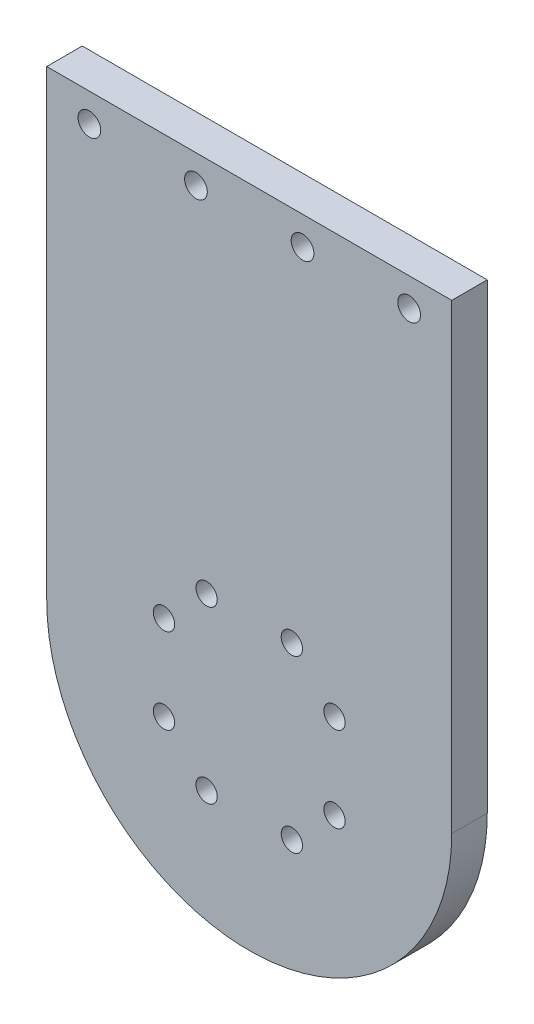
ISO-10303-21;
HEADER;
FILE_DESCRIPTION(('STEP AP214'),'2;1');
FILE_NAME('part.step','',(''),(''),'','','');
FILE_SCHEMA(('AUTOMOTIVE_DESIGN { 1 0 10303 214 1 1 1 1 }'));
ENDSEC;
DATA;
#1=APPLICATION_CONTEXT('core data for automotive mechanical design processes');
#2=APPLICATION_PROTOCOL_DEFINITION('international standard','automotive_design',2000,#1);
#3=PRODUCT_CONTEXT('',#1,'mechanical');
#4=PRODUCT('Part','Part','',(#3));
#5=PRODUCT_RELATED_PRODUCT_CATEGORY('part','',(#4));
#6=PRODUCT_DEFINITION_FORMATION('','',#4);
#7=PRODUCT_DEFINITION_CONTEXT('part definition',#1,'design');
#8=PRODUCT_DEFINITION('design','',#6,#7);
#9=PRODUCT_DEFINITION_SHAPE('','',#8);
#10=(LENGTH_UNIT() NAMED_UNIT(*) SI_UNIT(.MILLI.,.METRE.));
#11=(NAMED_UNIT(*) PLANE_ANGLE_UNIT() SI_UNIT($,.RADIAN.));
#12=(NAMED_UNIT(*) SI_UNIT($,.STERADIAN.) SOLID_ANGLE_UNIT());
#13=UNCERTAINTY_MEASURE_WITH_UNIT(LENGTH_MEASURE(1.E-05),#10,'distance_accuracy_value','');
#14=(GEOMETRIC_REPRESENTATION_CONTEXT(3) GLOBAL_UNCERTAINTY_ASSIGNED_CONTEXT((#13)) GLOBAL_UNIT_ASSIGNED_CONTEXT((#10,
#11,#12)) REPRESENTATION_CONTEXT('',''));
#15=CARTESIAN_POINT('',(0.,0.,0.));
#16=DIRECTION('',(0.,0.,1.));
#17=DIRECTION('',(1.,0.,0.));
#18=AXIS2_PLACEMENT_3D('',#15,#16,#17);
#19=CARTESIAN_POINT('',(22.5,-4.,-0.00100000000000013));
#20=DIRECTION('',(0.,0.,1.));
#21=DIRECTION('',(1.,0.,0.));
#22=AXIS2_PLACEMENT_3D('',#19,#20,#21);
#23=CYLINDRICAL_SURFACE('',#22,1.6);
#24=CARTESIAN_POINT('',(22.5,-4.,5.));
#25=DIRECTION('',(0.,0.,1.));
#26=DIRECTION('',(1.,0.,0.));
#27=AXIS2_PLACEMENT_3D('',#24,#25,#26);
#28=CIRCLE('',#27,1.6);
#29=CARTESIAN_POINT('',(24.1,-4.,5.));
#30=VERTEX_POINT('',#29);
#31=EDGE_CURVE('E50',#30,#30,#28,.T.);
#32=ORIENTED_EDGE('',*,*,#31,.T.);
#33=EDGE_LOOP('',(#32));
#34=FACE_BOUND('',#33,.T.);
#35=CARTESIAN_POINT('',(22.5,-4.,0.));
#36=DIRECTION('',(0.,0.,1.));
#37=DIRECTION('',(1.,0.,0.));
#38=AXIS2_PLACEMENT_3D('',#35,#36,#37);
#39=CIRCLE('',#38,1.6);
#40=CARTESIAN_POINT('',(24.1,-4.,0.));
#41=VERTEX_POINT('',#40);
#42=EDGE_CURVE('E11',#41,#41,#39,.F.);
#43=ORIENTED_EDGE('',*,*,#42,.T.);
#44=EDGE_LOOP('',(#43));
#45=FACE_BOUND('',#44,.T.);
#46=ADVANCED_FACE('F41',(#34,#45),#23,.F.);
#47=CARTESIAN_POINT('',(7.5,-4.,-0.00100000000000013));
#48=DIRECTION('',(0.,0.,1.));
#49=DIRECTION('',(1.,0.,0.));
#50=AXIS2_PLACEMENT_3D('',#47,#48,#49);
#51=CYLINDRICAL_SURFACE('',#50,1.6);
#52=CARTESIAN_POINT('',(7.5,-4.,5.));
#53=DIRECTION('',(0.,0.,1.));
#54=DIRECTION('',(1.,0.,0.));
#55=AXIS2_PLACEMENT_3D('',#52,#53,#54);
#56=CIRCLE('',#55,1.6);
#57=CARTESIAN_POINT('',(9.1,-4.,5.));
#58=VERTEX_POINT('',#57);
#59=EDGE_CURVE('E133',#58,#58,#56,.T.);
#60=ORIENTED_EDGE('',*,*,#59,.T.);
#61=EDGE_LOOP('',(#60));
#62=FACE_BOUND('',#61,.T.);
#63=CARTESIAN_POINT('',(7.5,-4.,0.));
#64=DIRECTION('',(0.,0.,1.));
#65=DIRECTION('',(1.,0.,0.));
#66=AXIS2_PLACEMENT_3D('',#63,#64,#65);
#67=CIRCLE('',#66,1.6);
#68=CARTESIAN_POINT('',(9.1,-4.,0.));
#69=VERTEX_POINT('',#68);
#70=EDGE_CURVE('E137',#69,#69,#67,.F.);
#71=ORIENTED_EDGE('',*,*,#70,.T.);
#72=EDGE_LOOP('',(#71));
#73=FACE_BOUND('',#72,.T.);
#74=ADVANCED_FACE('F163',(#62,#73),#51,.F.);
#75=CARTESIAN_POINT('',(-28.5,0.,5.));
#76=DIRECTION('',(1.,0.,0.));
#77=DIRECTION('',(0.,1.,0.));
#78=AXIS2_PLACEMENT_3D('',#75,#76,#77);
#79=PLANE('',#78);
#80=DIRECTION('',(0.,-1.,0.));
#81=VECTOR('',#80,1.);
#82=CARTESIAN_POINT('',(-28.5,0.,0.));
#83=LINE('',#82,#81);
#84=CARTESIAN_POINT('',(-28.5,0.,0.));
#85=VERTEX_POINT('',#84);
#86=CARTESIAN_POINT('',(-28.5,-65.,0.));
#87=VERTEX_POINT('',#86);
#88=EDGE_CURVE('E114',#85,#87,#83,.T.);
#89=ORIENTED_EDGE('',*,*,#88,.T.);
#90=DIRECTION('',(0.,0.,-1.));
#91=VECTOR('',#90,1.);
#92=CARTESIAN_POINT('',(-28.5,-65.,5.));
#93=LINE('',#92,#91);
#94=CARTESIAN_POINT('',(-28.5,-65.,5.));
#95=VERTEX_POINT('',#94);
#96=EDGE_CURVE('E104',#95,#87,#93,.T.);
#97=ORIENTED_EDGE('',*,*,#96,.F.);
#98=DIRECTION('',(0.,-1.,0.));
#99=VECTOR('',#98,1.);
#100=CARTESIAN_POINT('',(-28.5,0.,5.));
#101=LINE('',#100,#99);
#102=CARTESIAN_POINT('',(-28.5,0.,5.));
#103=VERTEX_POINT('',#102);
#104=EDGE_CURVE('E93',#103,#95,#101,.T.);
#105=ORIENTED_EDGE('',*,*,#104,.F.);
#106=DIRECTION('',(0.,0.,-1.));
#107=VECTOR('',#106,1.);
#108=CARTESIAN_POINT('',(-28.5,0.,5.));
#109=LINE('',#108,#107);
#110=EDGE_CURVE('E58',#103,#85,#109,.T.);
#111=ORIENTED_EDGE('',*,*,#110,.T.);
#112=EDGE_LOOP('',(#89,#97,#105,#111));
#113=FACE_BOUND('',#112,.T.);
#114=ADVANCED_FACE('F167',(#113),#79,.F.);
#115=CARTESIAN_POINT('',(0.,-65.,5.));
#116=DIRECTION('',(0.,0.,-1.));
#117=DIRECTION('',(-1.,0.,0.));
#118=AXIS2_PLACEMENT_3D('',#115,#116,#117);
#119=CYLINDRICAL_SURFACE('',#118,28.5);
#120=CARTESIAN_POINT('',(0.,-65.,0.));
#121=DIRECTION('',(0.,0.,1.));
#122=DIRECTION('',(1.,0.,0.));
#123=AXIS2_PLACEMENT_3D('',#120,#121,#122);
#124=CIRCLE('',#123,28.5);
#125=CARTESIAN_POINT('',(28.5,-65.,0.));
#126=VERTEX_POINT('',#125);
#127=EDGE_CURVE('E100',#87,#126,#124,.T.);
#128=ORIENTED_EDGE('',*,*,#127,.T.);
#129=DIRECTION('',(0.,0.,-1.));
#130=VECTOR('',#129,1.);
#131=CARTESIAN_POINT('',(28.5,-65.,5.));
#132=LINE('',#131,#130);
#133=CARTESIAN_POINT('',(28.5,-65.,5.));
#134=VERTEX_POINT('',#133);
#135=EDGE_CURVE('E98',#134,#126,#132,.T.);
#136=ORIENTED_EDGE('',*,*,#135,.F.);
#137=CARTESIAN_POINT('',(0.,-65.,5.));
#138=DIRECTION('',(0.,0.,1.));
#139=DIRECTION('',(1.,0.,0.));
#140=AXIS2_PLACEMENT_3D('',#137,#138,#139);
#141=CIRCLE('',#140,28.5);
#142=EDGE_CURVE('E84',#95,#134,#141,.T.);
#143=ORIENTED_EDGE('',*,*,#142,.F.);
#144=ORIENTED_EDGE('',*,*,#96,.T.);
#145=EDGE_LOOP('',(#128,#136,#143,#144));
#146=FACE_BOUND('',#145,.T.);
#147=ADVANCED_FACE('F99',(#146),#119,.T.);
#148=CARTESIAN_POINT('',(28.5,0.,5.));
#149=DIRECTION('',(1.,0.,0.));
#150=DIRECTION('',(0.,1.,0.));
#151=AXIS2_PLACEMENT_3D('',#148,#149,#150);
#152=PLANE('',#151);
#153=DIRECTION('',(0.,-1.,0.));
#154=VECTOR('',#153,1.);
#155=CARTESIAN_POINT('',(28.5,0.,0.));
#156=LINE('',#155,#154);
#157=CARTESIAN_POINT('',(28.5,0.,0.));
#158=VERTEX_POINT('',#157);
#159=EDGE_CURVE('E120',#158,#126,#156,.T.);
#160=ORIENTED_EDGE('',*,*,#159,.F.);
#161=DIRECTION('',(0.,0.,-1.));
#162=VECTOR('',#161,1.);
#163=CARTESIAN_POINT('',(28.5,0.,5.));
#164=LINE('',#163,#162);
#165=CARTESIAN_POINT('',(28.5,0.,5.));
#166=VERTEX_POINT('',#165);
#167=EDGE_CURVE('E72',#166,#158,#164,.T.);
#168=ORIENTED_EDGE('',*,*,#167,.F.);
#169=DIRECTION('',(0.,-1.,0.));
#170=VECTOR('',#169,1.);
#171=CARTESIAN_POINT('',(28.5,0.,5.));
#172=LINE('',#171,#170);
#173=EDGE_CURVE('E92',#166,#134,#172,.T.);
#174=ORIENTED_EDGE('',*,*,#173,.T.);
#175=ORIENTED_EDGE('',*,*,#135,.T.);
#176=EDGE_LOOP('',(#160,#168,#174,#175));
#177=FACE_BOUND('',#176,.T.);
#178=ADVANCED_FACE('F106',(#177),#152,.T.);
#179=CARTESIAN_POINT('',(-28.5,0.,5.));
#180=DIRECTION('',(0.,1.,0.));
#181=DIRECTION('',(0.,0.,1.));
#182=AXIS2_PLACEMENT_3D('',#179,#180,#181);
#183=PLANE('',#182);
#184=DIRECTION('',(1.,0.,0.));
#185=VECTOR('',#184,1.);
#186=CARTESIAN_POINT('',(-28.5,0.,0.));
#187=LINE('',#186,#185);
#188=EDGE_CURVE('E123',#85,#158,#187,.T.);
#189=ORIENTED_EDGE('',*,*,#188,.F.);
#190=ORIENTED_EDGE('',*,*,#110,.F.);
#191=DIRECTION('',(1.,0.,0.));
#192=VECTOR('',#191,1.);
#193=CARTESIAN_POINT('',(-28.5,0.,5.));
#194=LINE('',#193,#192);
#195=EDGE_CURVE('E108',#103,#166,#194,.T.);
#196=ORIENTED_EDGE('',*,*,#195,.T.);
#197=ORIENTED_EDGE('',*,*,#167,.T.);
#198=EDGE_LOOP('',(#189,#190,#196,#197));
#199=FACE_BOUND('',#198,.T.);
#200=ADVANCED_FACE('F148',(#199),#183,.T.);
#201=CARTESIAN_POINT('',(0.,-65.,5.));
#202=DIRECTION('',(0.,0.,1.));
#203=DIRECTION('',(1.,0.,0.));
#204=AXIS2_PLACEMENT_3D('',#201,#202,#203);
#205=PLANE('',#204);
#206=CARTESIAN_POINT('',(-12.,-71.,5.));
#207=DIRECTION('',(0.,0.,1.));
#208=DIRECTION('',(0.,1.,0.));
#209=AXIS2_PLACEMENT_3D('',#206,#207,#208);
#210=CIRCLE('',#209,1.5);
#211=CARTESIAN_POINT('',(-12.,-69.5,5.));
#212=VERTEX_POINT('',#211);
#213=EDGE_CURVE('E308',#212,#212,#210,.T.);
#214=ORIENTED_EDGE('',*,*,#213,.F.);
#215=EDGE_LOOP('',(#214));
#216=FACE_BOUND('',#215,.T.);
#217=CARTESIAN_POINT('',(-5.99999999999996,-77.,5.));
#218=DIRECTION('',(0.,0.,1.));
#219=DIRECTION('',(0.,1.,0.));
#220=AXIS2_PLACEMENT_3D('',#217,#218,#219);
#221=CIRCLE('',#220,1.5);
#222=CARTESIAN_POINT('',(-5.99999999999996,-75.5,5.));
#223=VERTEX_POINT('',#222);
#224=EDGE_CURVE('E323',#223,#223,#221,.T.);
#225=ORIENTED_EDGE('',*,*,#224,.F.);
#226=EDGE_LOOP('',(#225));
#227=FACE_BOUND('',#226,.T.);
#228=CARTESIAN_POINT('',(6.,-77.,5.));
#229=DIRECTION('',(0.,0.,1.));
#230=DIRECTION('',(-1.,0.,0.));
#231=AXIS2_PLACEMENT_3D('',#228,#229,#230);
#232=CIRCLE('',#231,1.5);
#233=CARTESIAN_POINT('',(4.5,-77.,5.));
#234=VERTEX_POINT('',#233);
#235=EDGE_CURVE('E331',#234,#234,#232,.T.);
#236=ORIENTED_EDGE('',*,*,#235,.F.);
#237=EDGE_LOOP('',(#236));
#238=FACE_BOUND('',#237,.T.);
#239=CARTESIAN_POINT('',(12.,-71.,5.));
#240=DIRECTION('',(0.,0.,1.));
#241=DIRECTION('',(-1.,0.,0.));
#242=AXIS2_PLACEMENT_3D('',#239,#240,#241);
#243=CIRCLE('',#242,1.5);
#244=CARTESIAN_POINT('',(10.5,-71.,5.));
#245=VERTEX_POINT('',#244);
#246=EDGE_CURVE('E339',#245,#245,#243,.T.);
#247=ORIENTED_EDGE('',*,*,#246,.F.);
#248=EDGE_LOOP('',(#247));
#249=FACE_BOUND('',#248,.T.);
#250=CARTESIAN_POINT('',(11.9999999999999,-58.9999999999999,5.));
#251=DIRECTION('',(0.,0.,1.));
#252=DIRECTION('',(0.,-1.,0.));
#253=AXIS2_PLACEMENT_3D('',#250,#251,#252);
#254=CIRCLE('',#253,1.5);
#255=CARTESIAN_POINT('',(12.,-60.4999999999999,5.));
#256=VERTEX_POINT('',#255);
#257=EDGE_CURVE('E347',#256,#256,#254,.T.);
#258=ORIENTED_EDGE('',*,*,#257,.F.);
#259=EDGE_LOOP('',(#258));
#260=FACE_BOUND('',#259,.T.);
#261=CARTESIAN_POINT('',(5.99999999999987,-52.9999999999999,5.));
#262=DIRECTION('',(0.,0.,1.));
#263=DIRECTION('',(0.,-1.,0.));
#264=AXIS2_PLACEMENT_3D('',#261,#262,#263);
#265=CIRCLE('',#264,1.5);
#266=CARTESIAN_POINT('',(5.99999999999989,-54.4999999999999,5.));
#267=VERTEX_POINT('',#266);
#268=EDGE_CURVE('E355',#267,#267,#265,.T.);
#269=ORIENTED_EDGE('',*,*,#268,.F.);
#270=EDGE_LOOP('',(#269));
#271=FACE_BOUND('',#270,.T.);
#272=CARTESIAN_POINT('',(-6.,-53.,5.));
#273=DIRECTION('',(0.,0.,1.));
#274=DIRECTION('',(1.,0.,0.));
#275=AXIS2_PLACEMENT_3D('',#272,#273,#274);
#276=CIRCLE('',#275,1.5);
#277=CARTESIAN_POINT('',(-4.5,-53.,5.));
#278=VERTEX_POINT('',#277);
#279=EDGE_CURVE('E362',#278,#278,#276,.T.);
#280=ORIENTED_EDGE('',*,*,#279,.F.);
#281=EDGE_LOOP('',(#280));
#282=FACE_BOUND('',#281,.T.);
#283=CARTESIAN_POINT('',(-12.,-59.,5.));
#284=DIRECTION('',(0.,0.,1.));
#285=DIRECTION('',(1.,0.,0.));
#286=AXIS2_PLACEMENT_3D('',#283,#284,#285);
#287=CIRCLE('',#286,1.5);
#288=CARTESIAN_POINT('',(-10.5,-59.,5.));
#289=VERTEX_POINT('',#288);
#290=EDGE_CURVE('E313',#289,#289,#287,.T.);
#291=ORIENTED_EDGE('',*,*,#290,.F.);
#292=EDGE_LOOP('',(#291));
#293=FACE_BOUND('',#292,.T.);
#294=CARTESIAN_POINT('',(-7.5,-4.,5.));
#295=DIRECTION('',(0.,0.,1.));
#296=DIRECTION('',(1.,0.,0.));
#297=AXIS2_PLACEMENT_3D('',#294,#295,#296);
#298=CIRCLE('',#297,1.6);
#299=CARTESIAN_POINT('',(-5.9,-4.,5.));
#300=VERTEX_POINT('',#299);
#301=EDGE_CURVE('E369',#300,#300,#298,.T.);
#302=ORIENTED_EDGE('',*,*,#301,.F.);
#303=EDGE_LOOP('',(#302));
#304=FACE_BOUND('',#303,.T.);
#305=CARTESIAN_POINT('',(-22.5,-4.,5.));
#306=DIRECTION('',(0.,0.,1.));
#307=DIRECTION('',(1.,0.,0.));
#308=AXIS2_PLACEMENT_3D('',#305,#306,#307);
#309=CIRCLE('',#308,1.6);
#310=CARTESIAN_POINT('',(-20.9,-4.,5.));
#311=VERTEX_POINT('',#310);
#312=EDGE_CURVE('E381',#311,#311,#309,.T.);
#313=ORIENTED_EDGE('',*,*,#312,.F.);
#314=EDGE_LOOP('',(#313));
#315=FACE_BOUND('',#314,.T.);
#316=ORIENTED_EDGE('',*,*,#104,.T.);
#317=ORIENTED_EDGE('',*,*,#142,.T.);
#318=ORIENTED_EDGE('',*,*,#173,.F.);
#319=ORIENTED_EDGE('',*,*,#195,.F.);
#320=EDGE_LOOP('',(#316,#317,#318,#319));
#321=FACE_BOUND('',#320,.T.);
#322=ORIENTED_EDGE('',*,*,#59,.F.);
#323=EDGE_LOOP('',(#322));
#324=FACE_BOUND('',#323,.T.);
#325=ORIENTED_EDGE('',*,*,#31,.F.);
#326=EDGE_LOOP('',(#325));
#327=FACE_BOUND('',#326,.T.);
#328=ADVANCED_FACE('F88',(#216,#227,#238,#249,#260,#271,#282,#293,#304,#315,#321,#324,#327),
#205,.T.);
#329=CARTESIAN_POINT('',(0.,-65.,0.));
#330=DIRECTION('',(0.,0.,1.));
#331=DIRECTION('',(1.,0.,0.));
#332=AXIS2_PLACEMENT_3D('',#329,#330,#331);
#333=PLANE('',#332);
#334=CARTESIAN_POINT('',(-12.,-71.,0.));
#335=DIRECTION('',(0.,0.,1.));
#336=DIRECTION('',(1.,0.,0.));
#337=AXIS2_PLACEMENT_3D('',#334,#335,#336);
#338=CIRCLE('',#337,1.5);
#339=CARTESIAN_POINT('',(-10.5,-71.,0.));
#340=VERTEX_POINT('',#339);
#341=EDGE_CURVE('E311',#340,#340,#338,.F.);
#342=ORIENTED_EDGE('',*,*,#341,.F.);
#343=EDGE_LOOP('',(#342));
#344=FACE_BOUND('',#343,.T.);
#345=CARTESIAN_POINT('',(-5.99999999999996,-77.,0.));
#346=DIRECTION('',(0.,0.,1.));
#347=DIRECTION('',(1.,0.,0.));
#348=AXIS2_PLACEMENT_3D('',#345,#346,#347);
#349=CIRCLE('',#348,1.5);
#350=CARTESIAN_POINT('',(-4.49999999999996,-77.,0.));
#351=VERTEX_POINT('',#350);
#352=EDGE_CURVE('E320',#351,#351,#349,.F.);
#353=ORIENTED_EDGE('',*,*,#352,.F.);
#354=EDGE_LOOP('',(#353));
#355=FACE_BOUND('',#354,.T.);
#356=CARTESIAN_POINT('',(6.,-77.,0.));
#357=DIRECTION('',(0.,0.,1.));
#358=DIRECTION('',(1.,0.,0.));
#359=AXIS2_PLACEMENT_3D('',#356,#357,#358);
#360=CIRCLE('',#359,1.5);
#361=CARTESIAN_POINT('',(7.5,-77.,0.));
#362=VERTEX_POINT('',#361);
#363=EDGE_CURVE('E327',#362,#362,#360,.F.);
#364=ORIENTED_EDGE('',*,*,#363,.F.);
#365=EDGE_LOOP('',(#364));
#366=FACE_BOUND('',#365,.T.);
#367=CARTESIAN_POINT('',(12.,-71.,0.));
#368=DIRECTION('',(0.,0.,1.));
#369=DIRECTION('',(1.,0.,0.));
#370=AXIS2_PLACEMENT_3D('',#367,#368,#369);
#371=CIRCLE('',#370,1.5);
#372=CARTESIAN_POINT('',(13.5,-71.,0.));
#373=VERTEX_POINT('',#372);
#374=EDGE_CURVE('E335',#373,#373,#371,.F.);
#375=ORIENTED_EDGE('',*,*,#374,.F.);
#376=EDGE_LOOP('',(#375));
#377=FACE_BOUND('',#376,.T.);
#378=CARTESIAN_POINT('',(11.9999999999999,-58.9999999999999,0.));
#379=DIRECTION('',(0.,0.,1.));
#380=DIRECTION('',(1.,0.,0.));
#381=AXIS2_PLACEMENT_3D('',#378,#379,#380);
#382=CIRCLE('',#381,1.5);
#383=CARTESIAN_POINT('',(13.4999999999999,-58.9999999999999,0.));
#384=VERTEX_POINT('',#383);
#385=EDGE_CURVE('E343',#384,#384,#382,.F.);
#386=ORIENTED_EDGE('',*,*,#385,.F.);
#387=EDGE_LOOP('',(#386));
#388=FACE_BOUND('',#387,.T.);
#389=CARTESIAN_POINT('',(5.99999999999987,-52.9999999999999,0.));
#390=DIRECTION('',(0.,0.,1.));
#391=DIRECTION('',(1.,0.,0.));
#392=AXIS2_PLACEMENT_3D('',#389,#390,#391);
#393=CIRCLE('',#392,1.5);
#394=CARTESIAN_POINT('',(7.49999999999987,-52.9999999999999,0.));
#395=VERTEX_POINT('',#394);
#396=EDGE_CURVE('E351',#395,#395,#393,.F.);
#397=ORIENTED_EDGE('',*,*,#396,.F.);
#398=EDGE_LOOP('',(#397));
#399=FACE_BOUND('',#398,.T.);
#400=CARTESIAN_POINT('',(-6.,-53.,0.));
#401=DIRECTION('',(0.,0.,1.));
#402=DIRECTION('',(1.,0.,0.));
#403=AXIS2_PLACEMENT_3D('',#400,#401,#402);
#404=CIRCLE('',#403,1.5);
#405=CARTESIAN_POINT('',(-4.5,-53.,0.));
#406=VERTEX_POINT('',#405);
#407=EDGE_CURVE('E366',#406,#406,#404,.F.);
#408=ORIENTED_EDGE('',*,*,#407,.F.);
#409=EDGE_LOOP('',(#408));
#410=FACE_BOUND('',#409,.T.);
#411=CARTESIAN_POINT('',(-12.,-59.,0.));
#412=DIRECTION('',(0.,0.,1.));
#413=DIRECTION('',(1.,0.,0.));
#414=AXIS2_PLACEMENT_3D('',#411,#412,#413);
#415=CIRCLE('',#414,1.5);
#416=CARTESIAN_POINT('',(-10.5,-59.,0.));
#417=VERTEX_POINT('',#416);
#418=EDGE_CURVE('E318',#417,#417,#415,.F.);
#419=ORIENTED_EDGE('',*,*,#418,.F.);
#420=EDGE_LOOP('',(#419));
#421=FACE_BOUND('',#420,.T.);
#422=CARTESIAN_POINT('',(-7.5,-4.,0.));
#423=DIRECTION('',(0.,0.,1.));
#424=DIRECTION('',(1.,0.,0.));
#425=AXIS2_PLACEMENT_3D('',#422,#423,#424);
#426=CIRCLE('',#425,1.6);
#427=CARTESIAN_POINT('',(-5.9,-4.,0.));
#428=VERTEX_POINT('',#427);
#429=EDGE_CURVE('E377',#428,#428,#426,.F.);
#430=ORIENTED_EDGE('',*,*,#429,.F.);
#431=EDGE_LOOP('',(#430));
#432=FACE_BOUND('',#431,.T.);
#433=CARTESIAN_POINT('',(-22.5,-4.,0.));
#434=DIRECTION('',(0.,0.,1.));
#435=DIRECTION('',(1.,0.,0.));
#436=AXIS2_PLACEMENT_3D('',#433,#434,#435);
#437=CIRCLE('',#436,1.6);
#438=CARTESIAN_POINT('',(-20.9,-4.,0.));
#439=VERTEX_POINT('',#438);
#440=EDGE_CURVE('E117',#439,#439,#437,.F.);
#441=ORIENTED_EDGE('',*,*,#440,.F.);
#442=EDGE_LOOP('',(#441));
#443=FACE_BOUND('',#442,.T.);
#444=ORIENTED_EDGE('',*,*,#88,.F.);
#445=ORIENTED_EDGE('',*,*,#188,.T.);
#446=ORIENTED_EDGE('',*,*,#159,.T.);
#447=ORIENTED_EDGE('',*,*,#127,.F.);
#448=EDGE_LOOP('',(#444,#445,#446,#447));
#449=FACE_BOUND('',#448,.T.);
#450=ORIENTED_EDGE('',*,*,#70,.F.);
#451=EDGE_LOOP('',(#450));
#452=FACE_BOUND('',#451,.T.);
#453=ORIENTED_EDGE('',*,*,#42,.F.);
#454=EDGE_LOOP('',(#453));
#455=FACE_BOUND('',#454,.T.);
#456=ADVANCED_FACE('F147',(#344,#355,#366,#377,#388,#399,#410,#421,#432,#443,#449,#452,#455),
#333,.F.);
#457=CARTESIAN_POINT('',(-22.5,-4.,-0.00100000000000013));
#458=DIRECTION('',(0.,0.,1.));
#459=DIRECTION('',(1.,0.,0.));
#460=AXIS2_PLACEMENT_3D('',#457,#458,#459);
#461=CYLINDRICAL_SURFACE('',#460,1.6);
#462=ORIENTED_EDGE('',*,*,#312,.T.);
#463=EDGE_LOOP('',(#462));
#464=FACE_BOUND('',#463,.T.);
#465=ORIENTED_EDGE('',*,*,#440,.T.);
#466=EDGE_LOOP('',(#465));
#467=FACE_BOUND('',#466,.T.);
#468=ADVANCED_FACE('F155',(#464,#467),#461,.F.);
#469=CARTESIAN_POINT('',(-7.5,-4.,-0.00100000000000013));
#470=DIRECTION('',(0.,0.,1.));
#471=DIRECTION('',(1.,0.,0.));
#472=AXIS2_PLACEMENT_3D('',#469,#470,#471);
#473=CYLINDRICAL_SURFACE('',#472,1.6);
#474=ORIENTED_EDGE('',*,*,#301,.T.);
#475=EDGE_LOOP('',(#474));
#476=FACE_BOUND('',#475,.T.);
#477=ORIENTED_EDGE('',*,*,#429,.T.);
#478=EDGE_LOOP('',(#477));
#479=FACE_BOUND('',#478,.T.);
#480=ADVANCED_FACE('F195',(#476,#479),#473,.F.);
#481=CARTESIAN_POINT('',(-12.,-59.,-0.00100000000000013));
#482=DIRECTION('',(0.,0.,1.));
#483=DIRECTION('',(1.,0.,0.));
#484=AXIS2_PLACEMENT_3D('',#481,#482,#483);
#485=CYLINDRICAL_SURFACE('',#484,1.5);
#486=ORIENTED_EDGE('',*,*,#290,.T.);
#487=EDGE_LOOP('',(#486));
#488=FACE_BOUND('',#487,.T.);
#489=ORIENTED_EDGE('',*,*,#418,.T.);
#490=EDGE_LOOP('',(#489));
#491=FACE_BOUND('',#490,.T.);
#492=ADVANCED_FACE('F214',(#488,#491),#485,.F.);
#493=CARTESIAN_POINT('',(-6.,-53.,-0.00100000000000013));
#494=DIRECTION('',(0.,0.,1.));
#495=DIRECTION('',(1.,0.,0.));
#496=AXIS2_PLACEMENT_3D('',#493,#494,#495);
#497=CYLINDRICAL_SURFACE('',#496,1.5);
#498=ORIENTED_EDGE('',*,*,#279,.T.);
#499=EDGE_LOOP('',(#498));
#500=FACE_BOUND('',#499,.T.);
#501=ORIENTED_EDGE('',*,*,#407,.T.);
#502=EDGE_LOOP('',(#501));
#503=FACE_BOUND('',#502,.T.);
#504=ADVANCED_FACE('F224',(#500,#503),#497,.F.);
#505=CARTESIAN_POINT('',(5.99999999999987,-52.9999999999999,-0.00100000000000013));
#506=DIRECTION('',(0.,0.,1.));
#507=DIRECTION('',(1.,0.,0.));
#508=AXIS2_PLACEMENT_3D('',#505,#506,#507);
#509=CYLINDRICAL_SURFACE('',#508,1.5);
#510=ORIENTED_EDGE('',*,*,#268,.T.);
#511=EDGE_LOOP('',(#510));
#512=FACE_BOUND('',#511,.T.);
#513=ORIENTED_EDGE('',*,*,#396,.T.);
#514=EDGE_LOOP('',(#513));
#515=FACE_BOUND('',#514,.T.);
#516=ADVANCED_FACE('F233',(#512,#515),#509,.F.);
#517=CARTESIAN_POINT('',(11.9999999999999,-58.9999999999999,-0.00100000000000013));
#518=DIRECTION('',(0.,0.,1.));
#519=DIRECTION('',(1.,0.,0.));
#520=AXIS2_PLACEMENT_3D('',#517,#518,#519);
#521=CYLINDRICAL_SURFACE('',#520,1.5);
#522=ORIENTED_EDGE('',*,*,#257,.T.);
#523=EDGE_LOOP('',(#522));
#524=FACE_BOUND('',#523,.T.);
#525=ORIENTED_EDGE('',*,*,#385,.T.);
#526=EDGE_LOOP('',(#525));
#527=FACE_BOUND('',#526,.T.);
#528=ADVANCED_FACE('F252',(#524,#527),#521,.F.);
#529=CARTESIAN_POINT('',(12.,-71.,-0.00100000000000013));
#530=DIRECTION('',(0.,0.,1.));
#531=DIRECTION('',(1.,0.,0.));
#532=AXIS2_PLACEMENT_3D('',#529,#530,#531);
#533=CYLINDRICAL_SURFACE('',#532,1.5);
#534=ORIENTED_EDGE('',*,*,#246,.T.);
#535=EDGE_LOOP('',(#534));
#536=FACE_BOUND('',#535,.T.);
#537=ORIENTED_EDGE('',*,*,#374,.T.);
#538=EDGE_LOOP('',(#537));
#539=FACE_BOUND('',#538,.T.);
#540=ADVANCED_FACE('F262',(#536,#539),#533,.F.);
#541=CARTESIAN_POINT('',(6.,-77.,-0.00100000000000013));
#542=DIRECTION('',(0.,0.,1.));
#543=DIRECTION('',(1.,0.,0.));
#544=AXIS2_PLACEMENT_3D('',#541,#542,#543);
#545=CYLINDRICAL_SURFACE('',#544,1.5);
#546=ORIENTED_EDGE('',*,*,#235,.T.);
#547=EDGE_LOOP('',(#546));
#548=FACE_BOUND('',#547,.T.);
#549=ORIENTED_EDGE('',*,*,#363,.T.);
#550=EDGE_LOOP('',(#549));
#551=FACE_BOUND('',#550,.T.);
#552=ADVANCED_FACE('F272',(#548,#551),#545,.F.);
#553=CARTESIAN_POINT('',(-5.99999999999996,-77.,-0.00100000000000013));
#554=DIRECTION('',(0.,0.,1.));
#555=DIRECTION('',(1.,0.,0.));
#556=AXIS2_PLACEMENT_3D('',#553,#554,#555);
#557=CYLINDRICAL_SURFACE('',#556,1.5);
#558=ORIENTED_EDGE('',*,*,#224,.T.);
#559=EDGE_LOOP('',(#558));
#560=FACE_BOUND('',#559,.T.);
#561=ORIENTED_EDGE('',*,*,#352,.T.);
#562=EDGE_LOOP('',(#561));
#563=FACE_BOUND('',#562,.T.);
#564=ADVANCED_FACE('F282',(#560,#563),#557,.F.);
#565=CARTESIAN_POINT('',(-12.,-71.,-0.00100000000000013));
#566=DIRECTION('',(0.,0.,1.));
#567=DIRECTION('',(1.,0.,0.));
#568=AXIS2_PLACEMENT_3D('',#565,#566,#567);
#569=CYLINDRICAL_SURFACE('',#568,1.5);
#570=ORIENTED_EDGE('',*,*,#213,.T.);
#571=EDGE_LOOP('',(#570));
#572=FACE_BOUND('',#571,.T.);
#573=ORIENTED_EDGE('',*,*,#341,.T.);
#574=EDGE_LOOP('',(#573));
#575=FACE_BOUND('',#574,.T.);
#576=ADVANCED_FACE('F292',(#572,#575),#569,.F.);
#577=CLOSED_SHELL('',(#46,#74,#114,#147,#178,#200,#328,#456,#468,#480,#492,#504,#516,#528,#540,
#552,#564,#576));
#578=MANIFOLD_SOLID_BREP('B2',#577);
#579=ADVANCED_BREP_SHAPE_REPRESENTATION('',(#18,#578),#14);
#580=SHAPE_DEFINITION_REPRESENTATION(#9,#579);
ENDSEC;
END-ISO-10303-21;
